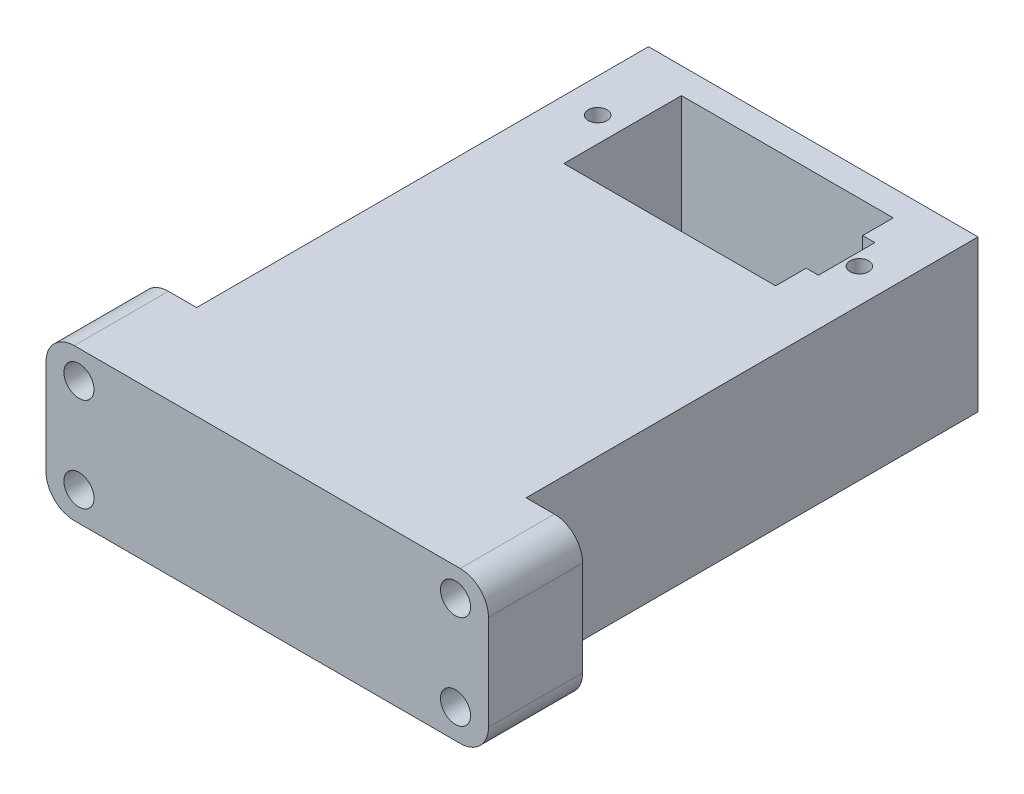
ISO-10303-21;
HEADER;
FILE_DESCRIPTION(('STEP AP214'),'2;1');
FILE_NAME('part.step','',(''),(''),'','','');
FILE_SCHEMA(('AUTOMOTIVE_DESIGN { 1 0 10303 214 1 1 1 1 }'));
ENDSEC;
DATA;
#1=APPLICATION_CONTEXT('core data for automotive mechanical design processes');
#2=APPLICATION_PROTOCOL_DEFINITION('international standard','automotive_design',2000,#1);
#3=PRODUCT_CONTEXT('',#1,'mechanical');
#4=PRODUCT('Part','Part','',(#3));
#5=PRODUCT_RELATED_PRODUCT_CATEGORY('part','',(#4));
#6=PRODUCT_DEFINITION_FORMATION('','',#4);
#7=PRODUCT_DEFINITION_CONTEXT('part definition',#1,'design');
#8=PRODUCT_DEFINITION('design','',#6,#7);
#9=PRODUCT_DEFINITION_SHAPE('','',#8);
#10=(LENGTH_UNIT() NAMED_UNIT(*) SI_UNIT(.MILLI.,.METRE.));
#11=(NAMED_UNIT(*) PLANE_ANGLE_UNIT() SI_UNIT($,.RADIAN.));
#12=(NAMED_UNIT(*) SI_UNIT($,.STERADIAN.) SOLID_ANGLE_UNIT());
#13=UNCERTAINTY_MEASURE_WITH_UNIT(LENGTH_MEASURE(1.E-05),#10,'distance_accuracy_value','');
#14=(GEOMETRIC_REPRESENTATION_CONTEXT(3) GLOBAL_UNCERTAINTY_ASSIGNED_CONTEXT((#13)) GLOBAL_UNIT_ASSIGNED_CONTEXT((#10,
#11,#12)) REPRESENTATION_CONTEXT('',''));
#15=CARTESIAN_POINT('',(0.,0.,0.));
#16=DIRECTION('',(0.,0.,1.));
#17=DIRECTION('',(1.,0.,0.));
#18=AXIS2_PLACEMENT_3D('',#15,#16,#17);
#19=CARTESIAN_POINT('',(11.25,16.1,6.25));
#20=DIRECTION('',(-1.,0.,0.));
#21=DIRECTION('',(0.,0.,1.));
#22=AXIS2_PLACEMENT_3D('',#19,#20,#21);
#23=PLANE('',#22);
#24=DIRECTION('',(0.,1.,0.));
#25=VECTOR('',#24,1.);
#26=CARTESIAN_POINT('',(11.25,0.,-3.00000000000001));
#27=LINE('',#26,#25);
#28=CARTESIAN_POINT('',(11.25,0.,-3.00000000000001));
#29=VERTEX_POINT('',#28);
#30=CARTESIAN_POINT('',(11.25,16.1,-3.00000000000001));
#31=VERTEX_POINT('',#30);
#32=EDGE_CURVE('E361',#29,#31,#27,.T.);
#33=ORIENTED_EDGE('',*,*,#32,.T.);
#34=DIRECTION('',(0.,0.,-1.));
#35=VECTOR('',#34,1.);
#36=CARTESIAN_POINT('',(11.25,16.1,6.25));
#37=LINE('',#36,#35);
#38=CARTESIAN_POINT('',(11.25,16.1,-6.25000000000001));
#39=VERTEX_POINT('',#38);
#40=EDGE_CURVE('E395',#31,#39,#37,.T.);
#41=ORIENTED_EDGE('',*,*,#40,.T.);
#42=DIRECTION('',(0.,-1.,0.));
#43=VECTOR('',#42,1.);
#44=CARTESIAN_POINT('',(11.25,16.1,-6.25000000000001));
#45=LINE('',#44,#43);
#46=CARTESIAN_POINT('',(11.25,0.,-6.25000000000001));
#47=VERTEX_POINT('',#46);
#48=EDGE_CURVE('E206',#39,#47,#45,.T.);
#49=ORIENTED_EDGE('',*,*,#48,.T.);
#50=DIRECTION('',(0.,0.,-1.));
#51=VECTOR('',#50,1.);
#52=CARTESIAN_POINT('',(11.25,0.,6.25));
#53=LINE('',#52,#51);
#54=EDGE_CURVE('E378',#29,#47,#53,.T.);
#55=ORIENTED_EDGE('',*,*,#54,.F.);
#56=EDGE_LOOP('',(#33,#41,#49,#55));
#57=FACE_BOUND('',#56,.T.);
#58=ADVANCED_FACE('F39',(#57),#23,.T.);
#59=CARTESIAN_POINT('',(0.,16.1,0.));
#60=DIRECTION('',(0.,-1.,0.));
#61=DIRECTION('',(0.,0.,-1.));
#62=AXIS2_PLACEMENT_3D('',#59,#60,#61);
#63=PLANE('',#62);
#64=CARTESIAN_POINT('',(-13.9,16.1,0.));
#65=DIRECTION('',(0.,1.,0.));
#66=DIRECTION('',(0.,0.,1.));
#67=AXIS2_PLACEMENT_3D('',#64,#65,#66);
#68=CIRCLE('',#67,1.);
#69=CARTESIAN_POINT('',(-13.9,16.1,1.));
#70=VERTEX_POINT('',#69);
#71=EDGE_CURVE('E379',#70,#70,#68,.T.);
#72=ORIENTED_EDGE('',*,*,#71,.F.);
#73=EDGE_LOOP('',(#72));
#74=FACE_BOUND('',#73,.T.);
#75=CARTESIAN_POINT('',(13.9,16.1,0.));
#76=DIRECTION('',(0.,1.,0.));
#77=DIRECTION('',(0.,0.,1.));
#78=AXIS2_PLACEMENT_3D('',#75,#76,#77);
#79=CIRCLE('',#78,1.);
#80=CARTESIAN_POINT('',(13.9,16.1,1.));
#81=VERTEX_POINT('',#80);
#82=EDGE_CURVE('E365',#81,#81,#79,.T.);
#83=ORIENTED_EDGE('',*,*,#82,.F.);
#84=EDGE_LOOP('',(#83));
#85=FACE_BOUND('',#84,.T.);
#86=DIRECTION('',(-1.,0.,0.));
#87=VECTOR('',#86,1.);
#88=CARTESIAN_POINT('',(-17.5,16.1,49.));
#89=LINE('',#88,#87);
#90=CARTESIAN_POINT('',(20.5,16.1,49.));
#91=VERTEX_POINT('',#90);
#92=CARTESIAN_POINT('',(-20.5,16.1,49.));
#93=VERTEX_POINT('',#92);
#94=EDGE_CURVE('E288',#91,#93,#89,.T.);
#95=ORIENTED_EDGE('',*,*,#94,.F.);
#96=DIRECTION('',(0.,0.,1.));
#97=VECTOR('',#96,1.);
#98=CARTESIAN_POINT('',(20.5,16.1,39.));
#99=LINE('',#98,#97);
#100=CARTESIAN_POINT('',(20.5,16.1,39.));
#101=VERTEX_POINT('',#100);
#102=EDGE_CURVE('E263',#91,#101,#99,.F.);
#103=ORIENTED_EDGE('',*,*,#102,.T.);
#104=DIRECTION('',(-1.,0.,0.));
#105=VECTOR('',#104,1.);
#106=CARTESIAN_POINT('',(17.5,16.1,39.));
#107=LINE('',#106,#105);
#108=CARTESIAN_POINT('',(17.5,16.1,39.));
#109=VERTEX_POINT('',#108);
#110=EDGE_CURVE('E326',#101,#109,#107,.T.);
#111=ORIENTED_EDGE('',*,*,#110,.T.);
#112=DIRECTION('',(0.,0.,-1.));
#113=VECTOR('',#112,1.);
#114=CARTESIAN_POINT('',(17.5,16.1,-9.00000000000001));
#115=LINE('',#114,#113);
#116=CARTESIAN_POINT('',(17.5,16.1,-9.00000000000001));
#117=VERTEX_POINT('',#116);
#118=EDGE_CURVE('E431',#109,#117,#115,.T.);
#119=ORIENTED_EDGE('',*,*,#118,.T.);
#120=DIRECTION('',(-1.,0.,0.));
#121=VECTOR('',#120,1.);
#122=CARTESIAN_POINT('',(17.5,16.1,-9.00000000000001));
#123=LINE('',#122,#121);
#124=CARTESIAN_POINT('',(-17.5,16.1,-9.));
#125=VERTEX_POINT('',#124);
#126=EDGE_CURVE('E216',#117,#125,#123,.T.);
#127=ORIENTED_EDGE('',*,*,#126,.T.);
#128=DIRECTION('',(0.,0.,1.));
#129=VECTOR('',#128,1.);
#130=CARTESIAN_POINT('',(-17.5,16.1,-9.));
#131=LINE('',#130,#129);
#132=CARTESIAN_POINT('',(-17.5,16.1,39.));
#133=VERTEX_POINT('',#132);
#134=EDGE_CURVE('E221',#125,#133,#131,.T.);
#135=ORIENTED_EDGE('',*,*,#134,.T.);
#136=DIRECTION('',(-1.,0.,0.));
#137=VECTOR('',#136,1.);
#138=CARTESIAN_POINT('',(-17.5,16.1,39.));
#139=LINE('',#138,#137);
#140=CARTESIAN_POINT('',(-20.5,16.1,39.));
#141=VERTEX_POINT('',#140);
#142=EDGE_CURVE('E193',#133,#141,#139,.T.);
#143=ORIENTED_EDGE('',*,*,#142,.T.);
#144=DIRECTION('',(0.,0.,1.));
#145=VECTOR('',#144,1.);
#146=CARTESIAN_POINT('',(-20.5,16.1,49.));
#147=LINE('',#146,#145);
#148=EDGE_CURVE('E259',#141,#93,#147,.T.);
#149=ORIENTED_EDGE('',*,*,#148,.T.);
#150=EDGE_LOOP('',(#95,#103,#111,#119,#127,#135,#143,#149));
#151=FACE_BOUND('',#150,.T.);
#152=ORIENTED_EDGE('',*,*,#40,.F.);
#153=DIRECTION('',(-1.,0.,0.));
#154=VECTOR('',#153,1.);
#155=CARTESIAN_POINT('',(12.55,16.1,-3.00000000000001));
#156=LINE('',#155,#154);
#157=CARTESIAN_POINT('',(12.55,16.1,-3.00000000000001));
#158=VERTEX_POINT('',#157);
#159=EDGE_CURVE('E343',#158,#31,#156,.T.);
#160=ORIENTED_EDGE('',*,*,#159,.F.);
#161=DIRECTION('',(0.,0.,-1.));
#162=VECTOR('',#161,1.);
#163=CARTESIAN_POINT('',(12.55,16.1,-3.00000000000001));
#164=LINE('',#163,#162);
#165=CARTESIAN_POINT('',(12.55,16.1,2.99999999999999));
#166=VERTEX_POINT('',#165);
#167=EDGE_CURVE('E355',#166,#158,#164,.T.);
#168=ORIENTED_EDGE('',*,*,#167,.F.);
#169=DIRECTION('',(1.,0.,0.));
#170=VECTOR('',#169,1.);
#171=CARTESIAN_POINT('',(12.55,16.1,2.99999999999999));
#172=LINE('',#171,#170);
#173=CARTESIAN_POINT('',(11.25,16.1,2.99999999999999));
#174=VERTEX_POINT('',#173);
#175=EDGE_CURVE('E335',#174,#166,#172,.T.);
#176=ORIENTED_EDGE('',*,*,#175,.F.);
#177=CARTESIAN_POINT('',(11.25,16.1,6.25));
#178=VERTEX_POINT('',#177);
#179=EDGE_CURVE('E390',#178,#174,#37,.T.);
#180=ORIENTED_EDGE('',*,*,#179,.F.);
#181=DIRECTION('',(1.,0.,0.));
#182=VECTOR('',#181,1.);
#183=CARTESIAN_POINT('',(-11.25,16.1,6.25));
#184=LINE('',#183,#182);
#185=CARTESIAN_POINT('',(-11.25,16.1,6.25));
#186=VERTEX_POINT('',#185);
#187=EDGE_CURVE('E402',#186,#178,#184,.T.);
#188=ORIENTED_EDGE('',*,*,#187,.F.);
#189=DIRECTION('',(0.,0.,1.));
#190=VECTOR('',#189,1.);
#191=CARTESIAN_POINT('',(-11.25,16.1,6.25));
#192=LINE('',#191,#190);
#193=CARTESIAN_POINT('',(-11.25,16.1,-6.25000000000001));
#194=VERTEX_POINT('',#193);
#195=EDGE_CURVE('E398',#194,#186,#192,.T.);
#196=ORIENTED_EDGE('',*,*,#195,.F.);
#197=DIRECTION('',(-1.,0.,0.));
#198=VECTOR('',#197,1.);
#199=CARTESIAN_POINT('',(-11.25,16.1,-6.25000000000001));
#200=LINE('',#199,#198);
#201=EDGE_CURVE('E394',#39,#194,#200,.T.);
#202=ORIENTED_EDGE('',*,*,#201,.F.);
#203=EDGE_LOOP('',(#152,#160,#168,#176,#180,#188,#196,#202));
#204=FACE_BOUND('',#203,.T.);
#205=ADVANCED_FACE('F277',(#74,#85,#151,#204),#63,.F.);
#206=CARTESIAN_POINT('',(0.,0.,0.));
#207=DIRECTION('',(0.,-1.,0.));
#208=DIRECTION('',(0.,0.,-1.));
#209=AXIS2_PLACEMENT_3D('',#206,#207,#208);
#210=PLANE('',#209);
#211=DIRECTION('',(-1.,0.,0.));
#212=VECTOR('',#211,1.);
#213=CARTESIAN_POINT('',(12.55,0.,-3.00000000000001));
#214=LINE('',#213,#212);
#215=CARTESIAN_POINT('',(12.55,0.,-3.00000000000001));
#216=VERTEX_POINT('',#215);
#217=EDGE_CURVE('E347',#216,#29,#214,.T.);
#218=ORIENTED_EDGE('',*,*,#217,.T.);
#219=ORIENTED_EDGE('',*,*,#54,.T.);
#220=DIRECTION('',(-1.,0.,0.));
#221=VECTOR('',#220,1.);
#222=CARTESIAN_POINT('',(-11.25,0.,-6.25000000000001));
#223=LINE('',#222,#221);
#224=CARTESIAN_POINT('',(-11.25,0.,-6.25000000000001));
#225=VERTEX_POINT('',#224);
#226=EDGE_CURVE('E410',#47,#225,#223,.T.);
#227=ORIENTED_EDGE('',*,*,#226,.T.);
#228=DIRECTION('',(0.,0.,1.));
#229=VECTOR('',#228,1.);
#230=CARTESIAN_POINT('',(-11.25,0.,6.25));
#231=LINE('',#230,#229);
#232=CARTESIAN_POINT('',(-11.25,0.,6.25));
#233=VERTEX_POINT('',#232);
#234=EDGE_CURVE('E414',#225,#233,#231,.T.);
#235=ORIENTED_EDGE('',*,*,#234,.T.);
#236=DIRECTION('',(1.,0.,0.));
#237=VECTOR('',#236,1.);
#238=CARTESIAN_POINT('',(-11.25,0.,6.25));
#239=LINE('',#238,#237);
#240=CARTESIAN_POINT('',(11.25,0.,6.25));
#241=VERTEX_POINT('',#240);
#242=EDGE_CURVE('E418',#233,#241,#239,.T.);
#243=ORIENTED_EDGE('',*,*,#242,.T.);
#244=CARTESIAN_POINT('',(11.25,0.,2.99999999999999));
#245=VERTEX_POINT('',#244);
#246=EDGE_CURVE('E406',#241,#245,#53,.T.);
#247=ORIENTED_EDGE('',*,*,#246,.T.);
#248=DIRECTION('',(1.,0.,0.));
#249=VECTOR('',#248,1.);
#250=CARTESIAN_POINT('',(12.55,0.,2.99999999999999));
#251=LINE('',#250,#249);
#252=CARTESIAN_POINT('',(12.55,0.,2.99999999999999));
#253=VERTEX_POINT('',#252);
#254=EDGE_CURVE('E338',#245,#253,#251,.T.);
#255=ORIENTED_EDGE('',*,*,#254,.T.);
#256=DIRECTION('',(0.,0.,-1.));
#257=VECTOR('',#256,1.);
#258=CARTESIAN_POINT('',(12.55,0.,-3.00000000000001));
#259=LINE('',#258,#257);
#260=EDGE_CURVE('E342',#253,#216,#259,.T.);
#261=ORIENTED_EDGE('',*,*,#260,.T.);
#262=EDGE_LOOP('',(#218,#219,#227,#235,#243,#247,#255,#261));
#263=FACE_BOUND('',#262,.T.);
#264=CARTESIAN_POINT('',(-13.9,0.,0.));
#265=DIRECTION('',(0.,1.,0.));
#266=DIRECTION('',(0.,0.,1.));
#267=AXIS2_PLACEMENT_3D('',#264,#265,#266);
#268=CIRCLE('',#267,1.);
#269=CARTESIAN_POINT('',(-13.9,0.,1.));
#270=VERTEX_POINT('',#269);
#271=EDGE_CURVE('E374',#270,#270,#268,.T.);
#272=ORIENTED_EDGE('',*,*,#271,.T.);
#273=EDGE_LOOP('',(#272));
#274=FACE_BOUND('',#273,.T.);
#275=CARTESIAN_POINT('',(13.9,0.,0.));
#276=DIRECTION('',(0.,1.,0.));
#277=DIRECTION('',(0.,0.,1.));
#278=AXIS2_PLACEMENT_3D('',#275,#276,#277);
#279=CIRCLE('',#278,1.);
#280=CARTESIAN_POINT('',(13.9,0.,1.));
#281=VERTEX_POINT('',#280);
#282=EDGE_CURVE('E383',#281,#281,#279,.T.);
#283=ORIENTED_EDGE('',*,*,#282,.T.);
#284=EDGE_LOOP('',(#283));
#285=FACE_BOUND('',#284,.T.);
#286=DIRECTION('',(1.,0.,0.));
#287=VECTOR('',#286,1.);
#288=CARTESIAN_POINT('',(17.5,0.,39.));
#289=LINE('',#288,#287);
#290=CARTESIAN_POINT('',(17.5,0.,39.));
#291=VERTEX_POINT('',#290);
#292=CARTESIAN_POINT('',(20.5,0.,39.));
#293=VERTEX_POINT('',#292);
#294=EDGE_CURVE('E319',#291,#293,#289,.T.);
#295=ORIENTED_EDGE('',*,*,#294,.T.);
#296=DIRECTION('',(0.,0.,1.));
#297=VECTOR('',#296,1.);
#298=CARTESIAN_POINT('',(20.5,0.,0.));
#299=LINE('',#298,#297);
#300=CARTESIAN_POINT('',(20.5,0.,49.));
#301=VERTEX_POINT('',#300);
#302=EDGE_CURVE('E230',#293,#301,#299,.T.);
#303=ORIENTED_EDGE('',*,*,#302,.T.);
#304=DIRECTION('',(1.,0.,0.));
#305=VECTOR('',#304,1.);
#306=CARTESIAN_POINT('',(-17.5,0.,49.));
#307=LINE('',#306,#305);
#308=CARTESIAN_POINT('',(-20.5,0.,49.));
#309=VERTEX_POINT('',#308);
#310=EDGE_CURVE('E332',#309,#301,#307,.T.);
#311=ORIENTED_EDGE('',*,*,#310,.F.);
#312=DIRECTION('',(0.,0.,1.));
#313=VECTOR('',#312,1.);
#314=CARTESIAN_POINT('',(-20.5,0.,0.));
#315=LINE('',#314,#313);
#316=CARTESIAN_POINT('',(-20.5,0.,39.));
#317=VERTEX_POINT('',#316);
#318=EDGE_CURVE('E185',#309,#317,#315,.F.);
#319=ORIENTED_EDGE('',*,*,#318,.T.);
#320=DIRECTION('',(1.,0.,0.));
#321=VECTOR('',#320,1.);
#322=CARTESIAN_POINT('',(-17.5,0.,39.));
#323=LINE('',#322,#321);
#324=CARTESIAN_POINT('',(-17.5,0.,39.));
#325=VERTEX_POINT('',#324);
#326=EDGE_CURVE('E176',#317,#325,#323,.T.);
#327=ORIENTED_EDGE('',*,*,#326,.T.);
#328=DIRECTION('',(0.,0.,1.));
#329=VECTOR('',#328,1.);
#330=CARTESIAN_POINT('',(-17.5,0.,-9.));
#331=LINE('',#330,#329);
#332=CARTESIAN_POINT('',(-17.5,0.,-9.));
#333=VERTEX_POINT('',#332);
#334=EDGE_CURVE('E182',#333,#325,#331,.T.);
#335=ORIENTED_EDGE('',*,*,#334,.F.);
#336=DIRECTION('',(-1.,0.,0.));
#337=VECTOR('',#336,1.);
#338=CARTESIAN_POINT('',(17.5,0.,-9.00000000000001));
#339=LINE('',#338,#337);
#340=CARTESIAN_POINT('',(17.5,0.,-9.00000000000001));
#341=VERTEX_POINT('',#340);
#342=EDGE_CURVE('E210',#341,#333,#339,.T.);
#343=ORIENTED_EDGE('',*,*,#342,.F.);
#344=DIRECTION('',(0.,0.,-1.));
#345=VECTOR('',#344,1.);
#346=CARTESIAN_POINT('',(17.5,0.,-9.00000000000001));
#347=LINE('',#346,#345);
#348=EDGE_CURVE('E205',#291,#341,#347,.T.);
#349=ORIENTED_EDGE('',*,*,#348,.F.);
#350=EDGE_LOOP('',(#295,#303,#311,#319,#327,#335,#343,#349));
#351=FACE_BOUND('',#350,.T.);
#352=ADVANCED_FACE('F179',(#263,#274,#285,#351),#210,.T.);
#353=CARTESIAN_POINT('',(-17.5,16.1,-9.));
#354=DIRECTION('',(1.,0.,0.));
#355=DIRECTION('',(0.,0.,-1.));
#356=AXIS2_PLACEMENT_3D('',#353,#354,#355);
#357=PLANE('',#356);
#358=ORIENTED_EDGE('',*,*,#334,.T.);
#359=DIRECTION('',(0.,1.,0.));
#360=VECTOR('',#359,1.);
#361=CARTESIAN_POINT('',(-17.5,16.1,39.));
#362=LINE('',#361,#360);
#363=EDGE_CURVE('E187',#325,#133,#362,.T.);
#364=ORIENTED_EDGE('',*,*,#363,.T.);
#365=ORIENTED_EDGE('',*,*,#134,.F.);
#366=DIRECTION('',(0.,-1.,0.));
#367=VECTOR('',#366,1.);
#368=CARTESIAN_POINT('',(-17.5,16.1,-9.));
#369=LINE('',#368,#367);
#370=EDGE_CURVE('E203',#125,#333,#369,.T.);
#371=ORIENTED_EDGE('',*,*,#370,.T.);
#372=EDGE_LOOP('',(#358,#364,#365,#371));
#373=FACE_BOUND('',#372,.T.);
#374=ADVANCED_FACE('F201',(#373),#357,.F.);
#375=CARTESIAN_POINT('',(17.5,16.1,-9.00000000000001));
#376=DIRECTION('',(-1.,0.,0.));
#377=DIRECTION('',(0.,0.,1.));
#378=AXIS2_PLACEMENT_3D('',#375,#376,#377);
#379=PLANE('',#378);
#380=ORIENTED_EDGE('',*,*,#118,.F.);
#381=DIRECTION('',(0.,-1.,0.));
#382=VECTOR('',#381,1.);
#383=CARTESIAN_POINT('',(17.5,16.1,39.));
#384=LINE('',#383,#382);
#385=EDGE_CURVE('E315',#109,#291,#384,.T.);
#386=ORIENTED_EDGE('',*,*,#385,.T.);
#387=ORIENTED_EDGE('',*,*,#348,.T.);
#388=DIRECTION('',(0.,-1.,0.));
#389=VECTOR('',#388,1.);
#390=CARTESIAN_POINT('',(17.5,16.1,-9.00000000000001));
#391=LINE('',#390,#389);
#392=EDGE_CURVE('E224',#117,#341,#391,.T.);
#393=ORIENTED_EDGE('',*,*,#392,.F.);
#394=EDGE_LOOP('',(#380,#386,#387,#393));
#395=FACE_BOUND('',#394,.T.);
#396=ADVANCED_FACE('F442',(#395),#379,.F.);
#397=CARTESIAN_POINT('',(17.5,16.1,-9.00000000000001));
#398=DIRECTION('',(0.,0.,1.));
#399=DIRECTION('',(1.,0.,0.));
#400=AXIS2_PLACEMENT_3D('',#397,#398,#399);
#401=PLANE('',#400);
#402=ORIENTED_EDGE('',*,*,#342,.T.);
#403=ORIENTED_EDGE('',*,*,#370,.F.);
#404=ORIENTED_EDGE('',*,*,#126,.F.);
#405=ORIENTED_EDGE('',*,*,#392,.T.);
#406=EDGE_LOOP('',(#402,#403,#404,#405));
#407=FACE_BOUND('',#406,.T.);
#408=ADVANCED_FACE('F438',(#407),#401,.F.);
#409=DIRECTION('',(0.,1.,0.));
#410=VECTOR('',#409,1.);
#411=CARTESIAN_POINT('',(11.25,0.,2.99999999999999));
#412=LINE('',#411,#410);
#413=EDGE_CURVE('E351',#245,#174,#412,.T.);
#414=ORIENTED_EDGE('',*,*,#413,.F.);
#415=ORIENTED_EDGE('',*,*,#246,.F.);
#416=DIRECTION('',(0.,-1.,0.));
#417=VECTOR('',#416,1.);
#418=CARTESIAN_POINT('',(11.25,16.1,6.25));
#419=LINE('',#418,#417);
#420=EDGE_CURVE('E405',#178,#241,#419,.T.);
#421=ORIENTED_EDGE('',*,*,#420,.F.);
#422=ORIENTED_EDGE('',*,*,#179,.T.);
#423=EDGE_LOOP('',(#414,#415,#421,#422));
#424=FACE_BOUND('',#423,.T.);
#425=ADVANCED_FACE('F467',(#424),#23,.T.);
#426=CARTESIAN_POINT('',(-11.25,16.1,-6.25000000000001));
#427=DIRECTION('',(0.,0.,1.));
#428=DIRECTION('',(1.,0.,0.));
#429=AXIS2_PLACEMENT_3D('',#426,#427,#428);
#430=PLANE('',#429);
#431=ORIENTED_EDGE('',*,*,#226,.F.);
#432=ORIENTED_EDGE('',*,*,#48,.F.);
#433=ORIENTED_EDGE('',*,*,#201,.T.);
#434=DIRECTION('',(0.,-1.,0.));
#435=VECTOR('',#434,1.);
#436=CARTESIAN_POINT('',(-11.25,16.1,-6.25000000000001));
#437=LINE('',#436,#435);
#438=EDGE_CURVE('E213',#194,#225,#437,.T.);
#439=ORIENTED_EDGE('',*,*,#438,.T.);
#440=EDGE_LOOP('',(#431,#432,#433,#439));
#441=FACE_BOUND('',#440,.T.);
#442=ADVANCED_FACE('F475',(#441),#430,.T.);
#443=CARTESIAN_POINT('',(-11.25,16.1,6.25));
#444=DIRECTION('',(1.,0.,0.));
#445=DIRECTION('',(0.,0.,-1.));
#446=AXIS2_PLACEMENT_3D('',#443,#444,#445);
#447=PLANE('',#446);
#448=ORIENTED_EDGE('',*,*,#234,.F.);
#449=ORIENTED_EDGE('',*,*,#438,.F.);
#450=ORIENTED_EDGE('',*,*,#195,.T.);
#451=DIRECTION('',(0.,-1.,0.));
#452=VECTOR('',#451,1.);
#453=CARTESIAN_POINT('',(-11.25,16.1,6.25));
#454=LINE('',#453,#452);
#455=EDGE_CURVE('E425',#186,#233,#454,.T.);
#456=ORIENTED_EDGE('',*,*,#455,.T.);
#457=EDGE_LOOP('',(#448,#449,#450,#456));
#458=FACE_BOUND('',#457,.T.);
#459=ADVANCED_FACE('F481',(#458),#447,.T.);
#460=CARTESIAN_POINT('',(-11.25,16.1,6.25));
#461=DIRECTION('',(0.,0.,-1.));
#462=DIRECTION('',(-1.,0.,0.));
#463=AXIS2_PLACEMENT_3D('',#460,#461,#462);
#464=PLANE('',#463);
#465=ORIENTED_EDGE('',*,*,#242,.F.);
#466=ORIENTED_EDGE('',*,*,#455,.F.);
#467=ORIENTED_EDGE('',*,*,#187,.T.);
#468=ORIENTED_EDGE('',*,*,#420,.T.);
#469=EDGE_LOOP('',(#465,#466,#467,#468));
#470=FACE_BOUND('',#469,.T.);
#471=ADVANCED_FACE('F494',(#470),#464,.T.);
#472=CARTESIAN_POINT('',(13.9,0.,0.));
#473=DIRECTION('',(0.,1.,0.));
#474=DIRECTION('',(0.,0.,1.));
#475=AXIS2_PLACEMENT_3D('',#472,#473,#474);
#476=CYLINDRICAL_SURFACE('',#475,1.);
#477=ORIENTED_EDGE('',*,*,#282,.F.);
#478=EDGE_LOOP('',(#477));
#479=FACE_BOUND('',#478,.T.);
#480=ORIENTED_EDGE('',*,*,#82,.T.);
#481=EDGE_LOOP('',(#480));
#482=FACE_BOUND('',#481,.T.);
#483=ADVANCED_FACE('F575',(#479,#482),#476,.F.);
#484=CARTESIAN_POINT('',(-13.9,0.,0.));
#485=DIRECTION('',(0.,1.,0.));
#486=DIRECTION('',(0.,0.,1.));
#487=AXIS2_PLACEMENT_3D('',#484,#485,#486);
#488=CYLINDRICAL_SURFACE('',#487,1.);
#489=ORIENTED_EDGE('',*,*,#271,.F.);
#490=EDGE_LOOP('',(#489));
#491=FACE_BOUND('',#490,.T.);
#492=ORIENTED_EDGE('',*,*,#71,.T.);
#493=EDGE_LOOP('',(#492));
#494=FACE_BOUND('',#493,.T.);
#495=ADVANCED_FACE('F568',(#491,#494),#488,.F.);
#496=CARTESIAN_POINT('',(12.55,0.,-3.00000000000001));
#497=DIRECTION('',(0.,0.,-1.));
#498=DIRECTION('',(-1.,0.,0.));
#499=AXIS2_PLACEMENT_3D('',#496,#497,#498);
#500=PLANE('',#499);
#501=ORIENTED_EDGE('',*,*,#159,.T.);
#502=ORIENTED_EDGE('',*,*,#32,.F.);
#503=ORIENTED_EDGE('',*,*,#217,.F.);
#504=DIRECTION('',(0.,1.,0.));
#505=VECTOR('',#504,1.);
#506=CARTESIAN_POINT('',(12.55,0.,-3.00000000000001));
#507=LINE('',#506,#505);
#508=EDGE_CURVE('E366',#216,#158,#507,.T.);
#509=ORIENTED_EDGE('',*,*,#508,.T.);
#510=EDGE_LOOP('',(#501,#502,#503,#509));
#511=FACE_BOUND('',#510,.T.);
#512=ADVANCED_FACE('F565',(#511),#500,.F.);
#513=CARTESIAN_POINT('',(12.55,0.,-3.00000000000001));
#514=DIRECTION('',(1.,0.,0.));
#515=DIRECTION('',(0.,0.,-1.));
#516=AXIS2_PLACEMENT_3D('',#513,#514,#515);
#517=PLANE('',#516);
#518=ORIENTED_EDGE('',*,*,#167,.T.);
#519=ORIENTED_EDGE('',*,*,#508,.F.);
#520=ORIENTED_EDGE('',*,*,#260,.F.);
#521=DIRECTION('',(0.,1.,0.));
#522=VECTOR('',#521,1.);
#523=CARTESIAN_POINT('',(12.55,0.,2.99999999999999));
#524=LINE('',#523,#522);
#525=EDGE_CURVE('E369',#253,#166,#524,.T.);
#526=ORIENTED_EDGE('',*,*,#525,.T.);
#527=EDGE_LOOP('',(#518,#519,#520,#526));
#528=FACE_BOUND('',#527,.T.);
#529=ADVANCED_FACE('F503',(#528),#517,.F.);
#530=CARTESIAN_POINT('',(12.55,0.,2.99999999999999));
#531=DIRECTION('',(0.,0.,1.));
#532=DIRECTION('',(1.,0.,0.));
#533=AXIS2_PLACEMENT_3D('',#530,#531,#532);
#534=PLANE('',#533);
#535=ORIENTED_EDGE('',*,*,#175,.T.);
#536=ORIENTED_EDGE('',*,*,#525,.F.);
#537=ORIENTED_EDGE('',*,*,#254,.F.);
#538=ORIENTED_EDGE('',*,*,#413,.T.);
#539=EDGE_LOOP('',(#535,#536,#537,#538));
#540=FACE_BOUND('',#539,.T.);
#541=ADVANCED_FACE('F500',(#540),#534,.F.);
#542=CARTESIAN_POINT('',(0.,0.,49.));
#543=DIRECTION('',(0.,0.,1.));
#544=DIRECTION('',(1.,0.,0.));
#545=AXIS2_PLACEMENT_3D('',#542,#543,#544);
#546=PLANE('',#545);
#547=ORIENTED_EDGE('',*,*,#310,.T.);
#548=CARTESIAN_POINT('',(20.5,3.,49.));
#549=DIRECTION('',(0.,0.,1.));
#550=DIRECTION('',(1.,0.,0.));
#551=AXIS2_PLACEMENT_3D('',#548,#549,#550);
#552=CIRCLE('',#551,3.);
#553=CARTESIAN_POINT('',(23.5,3.,49.));
#554=VERTEX_POINT('',#553);
#555=EDGE_CURVE('E243',#301,#554,#552,.T.);
#556=ORIENTED_EDGE('',*,*,#555,.T.);
#557=DIRECTION('',(0.,1.,0.));
#558=VECTOR('',#557,1.);
#559=CARTESIAN_POINT('',(23.5,16.1,49.));
#560=LINE('',#559,#558);
#561=CARTESIAN_POINT('',(23.5,13.1,49.));
#562=VERTEX_POINT('',#561);
#563=EDGE_CURVE('E311',#554,#562,#560,.T.);
#564=ORIENTED_EDGE('',*,*,#563,.T.);
#565=CARTESIAN_POINT('',(20.5,13.1,49.));
#566=DIRECTION('',(0.,0.,1.));
#567=DIRECTION('',(1.,0.,0.));
#568=AXIS2_PLACEMENT_3D('',#565,#566,#567);
#569=CIRCLE('',#568,3.);
#570=EDGE_CURVE('E240',#562,#91,#569,.T.);
#571=ORIENTED_EDGE('',*,*,#570,.T.);
#572=ORIENTED_EDGE('',*,*,#94,.T.);
#573=CARTESIAN_POINT('',(-20.5,13.1,49.));
#574=DIRECTION('',(0.,0.,1.));
#575=DIRECTION('',(1.,0.,0.));
#576=AXIS2_PLACEMENT_3D('',#573,#574,#575);
#577=CIRCLE('',#576,3.);
#578=CARTESIAN_POINT('',(-23.5,13.1,49.));
#579=VERTEX_POINT('',#578);
#580=EDGE_CURVE('E234',#93,#579,#577,.T.);
#581=ORIENTED_EDGE('',*,*,#580,.T.);
#582=DIRECTION('',(0.,-1.,0.));
#583=VECTOR('',#582,1.);
#584=CARTESIAN_POINT('',(-23.5,16.1,49.));
#585=LINE('',#584,#583);
#586=CARTESIAN_POINT('',(-23.5,3.,49.));
#587=VERTEX_POINT('',#586);
#588=EDGE_CURVE('E281',#579,#587,#585,.T.);
#589=ORIENTED_EDGE('',*,*,#588,.T.);
#590=CARTESIAN_POINT('',(-20.5,3.,49.));
#591=DIRECTION('',(0.,0.,1.));
#592=DIRECTION('',(1.,0.,0.));
#593=AXIS2_PLACEMENT_3D('',#590,#591,#592);
#594=CIRCLE('',#593,3.);
#595=EDGE_CURVE('E237',#587,#309,#594,.T.);
#596=ORIENTED_EDGE('',*,*,#595,.T.);
#597=EDGE_LOOP('',(#547,#556,#564,#571,#572,#581,#589,#596));
#598=FACE_BOUND('',#597,.T.);
#599=CARTESIAN_POINT('',(20.,13.1,49.));
#600=DIRECTION('',(0.,0.,1.));
#601=DIRECTION('',(1.,0.,0.));
#602=AXIS2_PLACEMENT_3D('',#599,#600,#601);
#603=CIRCLE('',#602,1.6);
#604=CARTESIAN_POINT('',(21.6,13.1,49.));
#605=VERTEX_POINT('',#604);
#606=EDGE_CURVE('E198',#605,#605,#603,.T.);
#607=ORIENTED_EDGE('',*,*,#606,.F.);
#608=EDGE_LOOP('',(#607));
#609=FACE_BOUND('',#608,.T.);
#610=CARTESIAN_POINT('',(20.,3.1,49.));
#611=DIRECTION('',(0.,0.,1.));
#612=DIRECTION('',(1.,0.,0.));
#613=AXIS2_PLACEMENT_3D('',#610,#611,#612);
#614=CIRCLE('',#613,1.6);
#615=CARTESIAN_POINT('',(21.6,3.1,49.));
#616=VERTEX_POINT('',#615);
#617=EDGE_CURVE('E303',#616,#616,#614,.T.);
#618=ORIENTED_EDGE('',*,*,#617,.F.);
#619=EDGE_LOOP('',(#618));
#620=FACE_BOUND('',#619,.T.);
#621=CARTESIAN_POINT('',(-20.,13.1,49.));
#622=DIRECTION('',(0.,0.,1.));
#623=DIRECTION('',(1.,0.,0.));
#624=AXIS2_PLACEMENT_3D('',#621,#622,#623);
#625=CIRCLE('',#624,1.6);
#626=CARTESIAN_POINT('',(-18.4,13.1,49.));
#627=VERTEX_POINT('',#626);
#628=EDGE_CURVE('E517',#627,#627,#625,.T.);
#629=ORIENTED_EDGE('',*,*,#628,.F.);
#630=EDGE_LOOP('',(#629));
#631=FACE_BOUND('',#630,.T.);
#632=CARTESIAN_POINT('',(-20.,3.1,49.));
#633=DIRECTION('',(0.,0.,1.));
#634=DIRECTION('',(1.,0.,0.));
#635=AXIS2_PLACEMENT_3D('',#632,#633,#634);
#636=CIRCLE('',#635,1.6);
#637=CARTESIAN_POINT('',(-18.4,3.1,49.));
#638=VERTEX_POINT('',#637);
#639=EDGE_CURVE('E296',#638,#638,#636,.T.);
#640=ORIENTED_EDGE('',*,*,#639,.F.);
#641=EDGE_LOOP('',(#640));
#642=FACE_BOUND('',#641,.T.);
#643=ADVANCED_FACE('F286',(#598,#609,#620,#631,#642),#546,.T.);
#644=CARTESIAN_POINT('',(23.5,16.1,39.));
#645=DIRECTION('',(1.,0.,0.));
#646=DIRECTION('',(0.,0.,-1.));
#647=AXIS2_PLACEMENT_3D('',#644,#645,#646);
#648=PLANE('',#647);
#649=ORIENTED_EDGE('',*,*,#563,.F.);
#650=DIRECTION('',(0.,0.,1.));
#651=VECTOR('',#650,1.);
#652=CARTESIAN_POINT('',(23.5,3.,39.));
#653=LINE('',#652,#651);
#654=CARTESIAN_POINT('',(23.5,3.,39.));
#655=VERTEX_POINT('',#654);
#656=EDGE_CURVE('E250',#554,#655,#653,.F.);
#657=ORIENTED_EDGE('',*,*,#656,.T.);
#658=DIRECTION('',(0.,1.,0.));
#659=VECTOR('',#658,1.);
#660=CARTESIAN_POINT('',(23.5,16.1,39.));
#661=LINE('',#660,#659);
#662=CARTESIAN_POINT('',(23.5,13.1,39.));
#663=VERTEX_POINT('',#662);
#664=EDGE_CURVE('E322',#655,#663,#661,.T.);
#665=ORIENTED_EDGE('',*,*,#664,.T.);
#666=DIRECTION('',(0.,0.,1.));
#667=VECTOR('',#666,1.);
#668=CARTESIAN_POINT('',(23.5,13.1,49.));
#669=LINE('',#668,#667);
#670=EDGE_CURVE('E246',#663,#562,#669,.T.);
#671=ORIENTED_EDGE('',*,*,#670,.T.);
#672=EDGE_LOOP('',(#649,#657,#665,#671));
#673=FACE_BOUND('',#672,.T.);
#674=ADVANCED_FACE('F536',(#673),#648,.T.);
#675=CARTESIAN_POINT('',(0.,0.,39.));
#676=DIRECTION('',(0.,0.,1.));
#677=DIRECTION('',(1.,0.,0.));
#678=AXIS2_PLACEMENT_3D('',#675,#676,#677);
#679=PLANE('',#678);
#680=CARTESIAN_POINT('',(20.,13.1,39.));
#681=DIRECTION('',(0.,0.,1.));
#682=DIRECTION('',(1.,0.,0.));
#683=AXIS2_PLACEMENT_3D('',#680,#681,#682);
#684=CIRCLE('',#683,1.6);
#685=CARTESIAN_POINT('',(21.6,13.1,39.));
#686=VERTEX_POINT('',#685);
#687=EDGE_CURVE('E299',#686,#686,#684,.T.);
#688=ORIENTED_EDGE('',*,*,#687,.T.);
#689=EDGE_LOOP('',(#688));
#690=FACE_BOUND('',#689,.T.);
#691=CARTESIAN_POINT('',(20.,3.1,39.));
#692=DIRECTION('',(0.,0.,1.));
#693=DIRECTION('',(1.,0.,0.));
#694=AXIS2_PLACEMENT_3D('',#691,#692,#693);
#695=CIRCLE('',#694,1.6);
#696=CARTESIAN_POINT('',(21.6,3.1,39.));
#697=VERTEX_POINT('',#696);
#698=EDGE_CURVE('E307',#697,#697,#695,.T.);
#699=ORIENTED_EDGE('',*,*,#698,.T.);
#700=EDGE_LOOP('',(#699));
#701=FACE_BOUND('',#700,.T.);
#702=ORIENTED_EDGE('',*,*,#664,.F.);
#703=CARTESIAN_POINT('',(20.5,3.,39.));
#704=DIRECTION('',(0.,0.,1.));
#705=DIRECTION('',(1.,0.,0.));
#706=AXIS2_PLACEMENT_3D('',#703,#704,#705);
#707=CIRCLE('',#706,3.);
#708=EDGE_CURVE('E256',#655,#293,#707,.F.);
#709=ORIENTED_EDGE('',*,*,#708,.T.);
#710=ORIENTED_EDGE('',*,*,#294,.F.);
#711=ORIENTED_EDGE('',*,*,#385,.F.);
#712=ORIENTED_EDGE('',*,*,#110,.F.);
#713=CARTESIAN_POINT('',(20.5,13.1,39.));
#714=DIRECTION('',(0.,0.,1.));
#715=DIRECTION('',(1.,0.,0.));
#716=AXIS2_PLACEMENT_3D('',#713,#714,#715);
#717=CIRCLE('',#716,3.);
#718=EDGE_CURVE('E253',#101,#663,#717,.F.);
#719=ORIENTED_EDGE('',*,*,#718,.T.);
#720=EDGE_LOOP('',(#702,#709,#710,#711,#712,#719));
#721=FACE_BOUND('',#720,.T.);
#722=ADVANCED_FACE('F447',(#690,#701,#721),#679,.F.);
#723=CARTESIAN_POINT('',(20.,3.1,39.));
#724=DIRECTION('',(0.,0.,1.));
#725=DIRECTION('',(1.,0.,0.));
#726=AXIS2_PLACEMENT_3D('',#723,#724,#725);
#727=CYLINDRICAL_SURFACE('',#726,1.6);
#728=ORIENTED_EDGE('',*,*,#698,.F.);
#729=EDGE_LOOP('',(#728));
#730=FACE_BOUND('',#729,.T.);
#731=ORIENTED_EDGE('',*,*,#617,.T.);
#732=EDGE_LOOP('',(#731));
#733=FACE_BOUND('',#732,.T.);
#734=ADVANCED_FACE('F554',(#730,#733),#727,.F.);
#735=CARTESIAN_POINT('',(20.,13.1,39.));
#736=DIRECTION('',(0.,0.,1.));
#737=DIRECTION('',(1.,0.,0.));
#738=AXIS2_PLACEMENT_3D('',#735,#736,#737);
#739=CYLINDRICAL_SURFACE('',#738,1.6);
#740=ORIENTED_EDGE('',*,*,#687,.F.);
#741=EDGE_LOOP('',(#740));
#742=FACE_BOUND('',#741,.T.);
#743=ORIENTED_EDGE('',*,*,#606,.T.);
#744=EDGE_LOOP('',(#743));
#745=FACE_BOUND('',#744,.T.);
#746=ADVANCED_FACE('F551',(#742,#745),#739,.F.);
#747=CARTESIAN_POINT('',(-23.5,16.1,39.));
#748=DIRECTION('',(-1.,0.,0.));
#749=DIRECTION('',(0.,0.,1.));
#750=AXIS2_PLACEMENT_3D('',#747,#748,#749);
#751=PLANE('',#750);
#752=DIRECTION('',(0.,-1.,0.));
#753=VECTOR('',#752,1.);
#754=CARTESIAN_POINT('',(-23.5,16.1,39.));
#755=LINE('',#754,#753);
#756=CARTESIAN_POINT('',(-23.5,13.1,39.));
#757=VERTEX_POINT('',#756);
#758=CARTESIAN_POINT('',(-23.5,3.,39.));
#759=VERTEX_POINT('',#758);
#760=EDGE_CURVE('E188',#757,#759,#755,.T.);
#761=ORIENTED_EDGE('',*,*,#760,.T.);
#762=DIRECTION('',(0.,0.,1.));
#763=VECTOR('',#762,1.);
#764=CARTESIAN_POINT('',(-23.5,3.,39.));
#765=LINE('',#764,#763);
#766=EDGE_CURVE('E268',#759,#587,#765,.T.);
#767=ORIENTED_EDGE('',*,*,#766,.T.);
#768=ORIENTED_EDGE('',*,*,#588,.F.);
#769=DIRECTION('',(0.,0.,1.));
#770=VECTOR('',#769,1.);
#771=CARTESIAN_POINT('',(-23.5,13.1,39.));
#772=LINE('',#771,#770);
#773=EDGE_CURVE('E60',#579,#757,#772,.F.);
#774=ORIENTED_EDGE('',*,*,#773,.T.);
#775=EDGE_LOOP('',(#761,#767,#768,#774));
#776=FACE_BOUND('',#775,.T.);
#777=ADVANCED_FACE('F289',(#776),#751,.T.);
#778=CARTESIAN_POINT('',(0.,0.,39.));
#779=DIRECTION('',(0.,0.,1.));
#780=DIRECTION('',(1.,0.,0.));
#781=AXIS2_PLACEMENT_3D('',#778,#779,#780);
#782=PLANE('',#781);
#783=CARTESIAN_POINT('',(-20.,13.1,39.));
#784=DIRECTION('',(0.,0.,1.));
#785=DIRECTION('',(1.,0.,0.));
#786=AXIS2_PLACEMENT_3D('',#783,#784,#785);
#787=CIRCLE('',#786,1.6);
#788=CARTESIAN_POINT('',(-18.4,13.1,39.));
#789=VERTEX_POINT('',#788);
#790=EDGE_CURVE('E515',#789,#789,#787,.T.);
#791=ORIENTED_EDGE('',*,*,#790,.T.);
#792=EDGE_LOOP('',(#791));
#793=FACE_BOUND('',#792,.T.);
#794=CARTESIAN_POINT('',(-20.,3.1,39.));
#795=DIRECTION('',(0.,0.,1.));
#796=DIRECTION('',(1.,0.,0.));
#797=AXIS2_PLACEMENT_3D('',#794,#795,#796);
#798=CIRCLE('',#797,1.6);
#799=CARTESIAN_POINT('',(-18.4,3.1,39.));
#800=VERTEX_POINT('',#799);
#801=EDGE_CURVE('E292',#800,#800,#798,.T.);
#802=ORIENTED_EDGE('',*,*,#801,.T.);
#803=EDGE_LOOP('',(#802));
#804=FACE_BOUND('',#803,.T.);
#805=ORIENTED_EDGE('',*,*,#326,.F.);
#806=CARTESIAN_POINT('',(-20.5,3.,39.));
#807=DIRECTION('',(0.,0.,1.));
#808=DIRECTION('',(1.,0.,0.));
#809=AXIS2_PLACEMENT_3D('',#806,#807,#808);
#810=CIRCLE('',#809,3.);
#811=EDGE_CURVE('E11',#317,#759,#810,.F.);
#812=ORIENTED_EDGE('',*,*,#811,.T.);
#813=ORIENTED_EDGE('',*,*,#760,.F.);
#814=CARTESIAN_POINT('',(-20.5,13.1,39.));
#815=DIRECTION('',(0.,0.,1.));
#816=DIRECTION('',(1.,0.,0.));
#817=AXIS2_PLACEMENT_3D('',#814,#815,#816);
#818=CIRCLE('',#817,3.);
#819=EDGE_CURVE('E48',#757,#141,#818,.F.);
#820=ORIENTED_EDGE('',*,*,#819,.T.);
#821=ORIENTED_EDGE('',*,*,#142,.F.);
#822=ORIENTED_EDGE('',*,*,#363,.F.);
#823=EDGE_LOOP('',(#805,#812,#813,#820,#821,#822));
#824=FACE_BOUND('',#823,.T.);
#825=ADVANCED_FACE('F191',(#793,#804,#824),#782,.F.);
#826=CARTESIAN_POINT('',(-20.,3.1,39.));
#827=DIRECTION('',(0.,0.,1.));
#828=DIRECTION('',(1.,0.,0.));
#829=AXIS2_PLACEMENT_3D('',#826,#827,#828);
#830=CYLINDRICAL_SURFACE('',#829,1.6);
#831=ORIENTED_EDGE('',*,*,#801,.F.);
#832=EDGE_LOOP('',(#831));
#833=FACE_BOUND('',#832,.T.);
#834=ORIENTED_EDGE('',*,*,#639,.T.);
#835=EDGE_LOOP('',(#834));
#836=FACE_BOUND('',#835,.T.);
#837=ADVANCED_FACE('F530',(#833,#836),#830,.F.);
#838=CARTESIAN_POINT('',(-20.,13.1,39.));
#839=DIRECTION('',(0.,0.,1.));
#840=DIRECTION('',(1.,0.,0.));
#841=AXIS2_PLACEMENT_3D('',#838,#839,#840);
#842=CYLINDRICAL_SURFACE('',#841,1.6);
#843=ORIENTED_EDGE('',*,*,#790,.F.);
#844=EDGE_LOOP('',(#843));
#845=FACE_BOUND('',#844,.T.);
#846=ORIENTED_EDGE('',*,*,#628,.T.);
#847=EDGE_LOOP('',(#846));
#848=FACE_BOUND('',#847,.T.);
#849=ADVANCED_FACE('F527',(#845,#848),#842,.F.);
#850=CARTESIAN_POINT('',(20.5,3.,0.));
#851=DIRECTION('',(0.,0.,1.));
#852=DIRECTION('',(1.,0.,0.));
#853=AXIS2_PLACEMENT_3D('',#850,#851,#852);
#854=CYLINDRICAL_SURFACE('',#853,3.);
#855=ORIENTED_EDGE('',*,*,#708,.F.);
#856=ORIENTED_EDGE('',*,*,#656,.F.);
#857=ORIENTED_EDGE('',*,*,#555,.F.);
#858=ORIENTED_EDGE('',*,*,#302,.F.);
#859=EDGE_LOOP('',(#855,#856,#857,#858));
#860=FACE_BOUND('',#859,.T.);
#861=ADVANCED_FACE('F452',(#860),#854,.T.);
#862=CARTESIAN_POINT('',(20.5,13.1,39.));
#863=DIRECTION('',(0.,0.,-1.));
#864=DIRECTION('',(-1.,0.,0.));
#865=AXIS2_PLACEMENT_3D('',#862,#863,#864);
#866=CYLINDRICAL_SURFACE('',#865,3.);
#867=ORIENTED_EDGE('',*,*,#718,.F.);
#868=ORIENTED_EDGE('',*,*,#102,.F.);
#869=ORIENTED_EDGE('',*,*,#570,.F.);
#870=ORIENTED_EDGE('',*,*,#670,.F.);
#871=EDGE_LOOP('',(#867,#868,#869,#870));
#872=FACE_BOUND('',#871,.T.);
#873=ADVANCED_FACE('F457',(#872),#866,.T.);
#874=CARTESIAN_POINT('',(-20.5,3.,39.));
#875=DIRECTION('',(0.,0.,1.));
#876=DIRECTION('',(1.,0.,0.));
#877=AXIS2_PLACEMENT_3D('',#874,#875,#876);
#878=CYLINDRICAL_SURFACE('',#877,3.);
#879=ORIENTED_EDGE('',*,*,#811,.F.);
#880=ORIENTED_EDGE('',*,*,#318,.F.);
#881=ORIENTED_EDGE('',*,*,#595,.F.);
#882=ORIENTED_EDGE('',*,*,#766,.F.);
#883=EDGE_LOOP('',(#879,#880,#881,#882));
#884=FACE_BOUND('',#883,.T.);
#885=ADVANCED_FACE('F455',(#884),#878,.T.);
#886=CARTESIAN_POINT('',(-20.5,13.1,0.));
#887=DIRECTION('',(0.,0.,-1.));
#888=DIRECTION('',(-1.,0.,0.));
#889=AXIS2_PLACEMENT_3D('',#886,#887,#888);
#890=CYLINDRICAL_SURFACE('',#889,3.);
#891=ORIENTED_EDGE('',*,*,#819,.F.);
#892=ORIENTED_EDGE('',*,*,#773,.F.);
#893=ORIENTED_EDGE('',*,*,#580,.F.);
#894=ORIENTED_EDGE('',*,*,#148,.F.);
#895=EDGE_LOOP('',(#891,#892,#893,#894));
#896=FACE_BOUND('',#895,.T.);
#897=ADVANCED_FACE('F41',(#896),#890,.T.);
#898=CLOSED_SHELL('',(#58,#205,#352,#374,#396,#408,#425,#442,#459,#471,#483,#495,#512,#529,#541,
#643,#674,#722,#734,#746,#777,#825,#837,#849,#861,#873,#885,#897));
#899=MANIFOLD_SOLID_BREP('B2',#898);
#900=ADVANCED_BREP_SHAPE_REPRESENTATION('',(#18,#899),#14);
#901=SHAPE_DEFINITION_REPRESENTATION(#9,#900);
ENDSEC;
END-ISO-10303-21;
